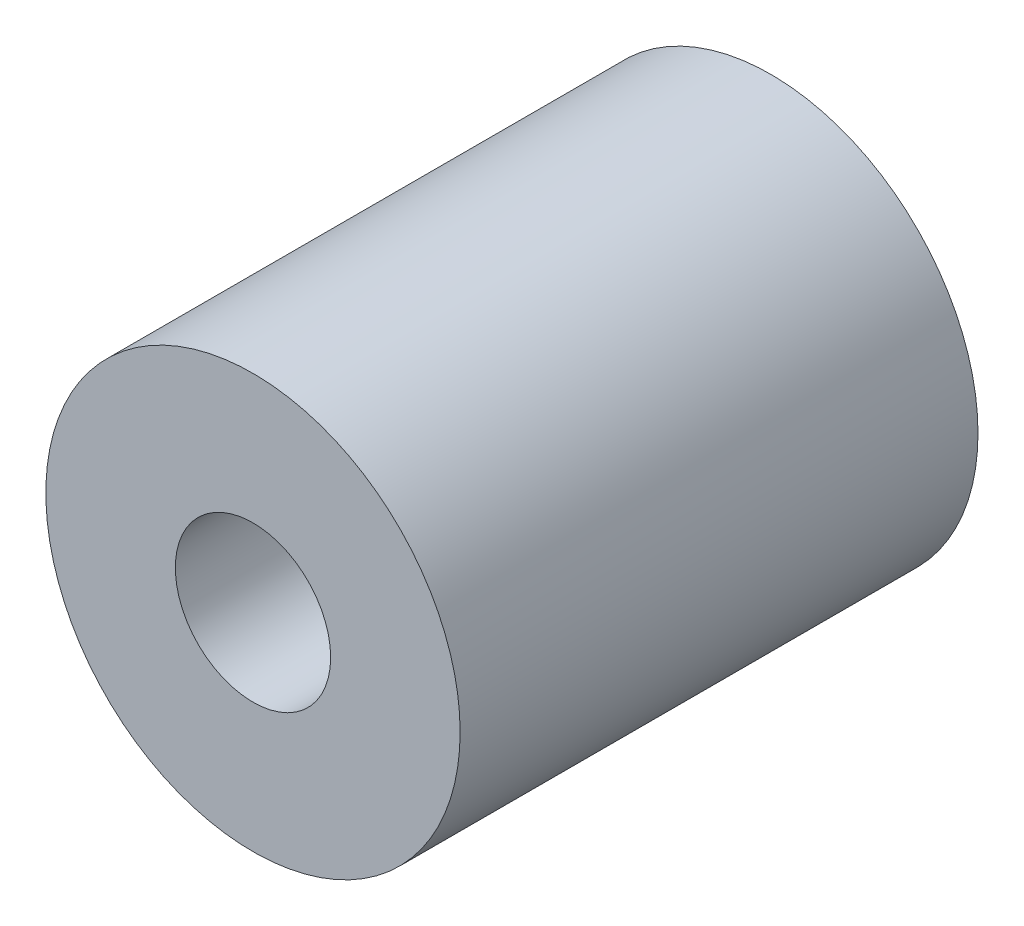
ISO-10303-21;
HEADER;
FILE_DESCRIPTION(('STEP AP214'),'2;1');
FILE_NAME('part.step','',(''),(''),'','','');
FILE_SCHEMA(('AUTOMOTIVE_DESIGN { 1 0 10303 214 1 1 1 1 }'));
ENDSEC;
DATA;
#1=APPLICATION_CONTEXT('core data for automotive mechanical design processes');
#2=APPLICATION_PROTOCOL_DEFINITION('international standard','automotive_design',2000,#1);
#3=PRODUCT_CONTEXT('',#1,'mechanical');
#4=PRODUCT('Part','Part','',(#3));
#5=PRODUCT_RELATED_PRODUCT_CATEGORY('part','',(#4));
#6=PRODUCT_DEFINITION_FORMATION('','',#4);
#7=PRODUCT_DEFINITION_CONTEXT('part definition',#1,'design');
#8=PRODUCT_DEFINITION('design','',#6,#7);
#9=PRODUCT_DEFINITION_SHAPE('','',#8);
#10=(LENGTH_UNIT() NAMED_UNIT(*) SI_UNIT(.MILLI.,.METRE.));
#11=(NAMED_UNIT(*) PLANE_ANGLE_UNIT() SI_UNIT($,.RADIAN.));
#12=(NAMED_UNIT(*) SI_UNIT($,.STERADIAN.) SOLID_ANGLE_UNIT());
#13=UNCERTAINTY_MEASURE_WITH_UNIT(LENGTH_MEASURE(1.E-05),#10,'distance_accuracy_value','');
#14=(GEOMETRIC_REPRESENTATION_CONTEXT(3) GLOBAL_UNCERTAINTY_ASSIGNED_CONTEXT((#13)) GLOBAL_UNIT_ASSIGNED_CONTEXT((#10,
#11,#12)) REPRESENTATION_CONTEXT('',''));
#15=CARTESIAN_POINT('',(0.,0.,0.));
#16=DIRECTION('',(0.,0.,1.));
#17=DIRECTION('',(1.,0.,0.));
#18=AXIS2_PLACEMENT_3D('',#15,#16,#17);
#19=CARTESIAN_POINT('',(0.,0.,-10.));
#20=DIRECTION('',(0.,0.,1.));
#21=DIRECTION('',(1.,0.,0.));
#22=AXIS2_PLACEMENT_3D('',#19,#20,#21);
#23=CYLINDRICAL_SURFACE('',#22,8.);
#24=CARTESIAN_POINT('',(0.,0.,-10.));
#25=DIRECTION('',(0.,0.,1.));
#26=DIRECTION('',(1.,0.,0.));
#27=AXIS2_PLACEMENT_3D('',#24,#25,#26);
#28=CIRCLE('',#27,8.);
#29=CARTESIAN_POINT('',(8.,0.,-10.));
#30=VERTEX_POINT('',#29);
#31=EDGE_CURVE('E10',#30,#30,#28,.T.);
#32=ORIENTED_EDGE('',*,*,#31,.T.);
#33=EDGE_LOOP('',(#32));
#34=FACE_BOUND('',#33,.T.);
#35=CARTESIAN_POINT('',(0.,0.,10.));
#36=DIRECTION('',(0.,0.,1.));
#37=DIRECTION('',(1.,0.,0.));
#38=AXIS2_PLACEMENT_3D('',#35,#36,#37);
#39=CIRCLE('',#38,8.);
#40=CARTESIAN_POINT('',(8.,0.,10.));
#41=VERTEX_POINT('',#40);
#42=EDGE_CURVE('E39',#41,#41,#39,.T.);
#43=ORIENTED_EDGE('',*,*,#42,.F.);
#44=EDGE_LOOP('',(#43));
#45=FACE_BOUND('',#44,.T.);
#46=ADVANCED_FACE('F32',(#34,#45),#23,.T.);
#47=CARTESIAN_POINT('',(0.,0.,-10.));
#48=DIRECTION('',(0.,0.,1.));
#49=DIRECTION('',(1.,0.,0.));
#50=AXIS2_PLACEMENT_3D('',#47,#48,#49);
#51=PLANE('',#50);
#52=CARTESIAN_POINT('',(0.,0.,-10.));
#53=DIRECTION('',(0.,0.,-1.));
#54=DIRECTION('',(-1.,0.,0.));
#55=AXIS2_PLACEMENT_3D('',#52,#53,#54);
#56=CIRCLE('',#55,2.5);
#57=CARTESIAN_POINT('',(-2.5,0.,-10.));
#58=VERTEX_POINT('',#57);
#59=EDGE_CURVE('E51',#58,#58,#56,.T.);
#60=ORIENTED_EDGE('',*,*,#59,.F.);
#61=EDGE_LOOP('',(#60));
#62=FACE_BOUND('',#61,.T.);
#63=ORIENTED_EDGE('',*,*,#31,.F.);
#64=EDGE_LOOP('',(#63));
#65=FACE_BOUND('',#64,.T.);
#66=ADVANCED_FACE('F71',(#62,#65),#51,.F.);
#67=CARTESIAN_POINT('',(0.,0.,10.));
#68=DIRECTION('',(0.,0.,1.));
#69=DIRECTION('',(1.,0.,0.));
#70=AXIS2_PLACEMENT_3D('',#67,#68,#69);
#71=PLANE('',#70);
#72=CARTESIAN_POINT('',(0.,0.,10.));
#73=DIRECTION('',(0.,0.,1.));
#74=DIRECTION('',(1.,0.,0.));
#75=AXIS2_PLACEMENT_3D('',#72,#73,#74);
#76=CIRCLE('',#75,2.99999999999999);
#77=CARTESIAN_POINT('',(2.99999999999999,0.,10.));
#78=VERTEX_POINT('',#77);
#79=EDGE_CURVE('E48',#78,#78,#76,.T.);
#80=ORIENTED_EDGE('',*,*,#79,.F.);
#81=EDGE_LOOP('',(#80));
#82=FACE_BOUND('',#81,.T.);
#83=ORIENTED_EDGE('',*,*,#42,.T.);
#84=EDGE_LOOP('',(#83));
#85=FACE_BOUND('',#84,.T.);
#86=ADVANCED_FACE('F75',(#82,#85),#71,.T.);
#87=CARTESIAN_POINT('',(0.,0.,1.80258185708268));
#88=DIRECTION('',(0.,0.,1.));
#89=DIRECTION('',(1.,0.,0.));
#90=AXIS2_PLACEMENT_3D('',#87,#88,#89);
#91=CONICAL_SURFACE('',#90,3.,1.02974425867665);
#92=CARTESIAN_POINT('',(0.,0.,1.5021515475689));
#93=DIRECTION('',(0.,0.,1.));
#94=DIRECTION('',(1.,0.,0.));
#95=AXIS2_PLACEMENT_3D('',#92,#93,#94);
#96=CIRCLE('',#95,2.5);
#97=CARTESIAN_POINT('',(2.5,0.,1.5021515475689));
#98=VERTEX_POINT('',#97);
#99=EDGE_CURVE('E35',#98,#98,#96,.F.);
#100=ORIENTED_EDGE('',*,*,#99,.T.);
#101=EDGE_LOOP('',(#100));
#102=FACE_BOUND('',#101,.T.);
#103=CARTESIAN_POINT('',(0.,0.,1.80258185708268));
#104=DIRECTION('',(0.,0.,1.));
#105=DIRECTION('',(1.,0.,0.));
#106=AXIS2_PLACEMENT_3D('',#103,#104,#105);
#107=CIRCLE('',#106,3.);
#108=CARTESIAN_POINT('',(3.,0.,1.80258185708268));
#109=VERTEX_POINT('',#108);
#110=EDGE_CURVE('E43',#109,#109,#107,.T.);
#111=ORIENTED_EDGE('',*,*,#110,.T.);
#112=EDGE_LOOP('',(#111));
#113=FACE_BOUND('',#112,.T.);
#114=ADVANCED_FACE('F58',(#102,#113),#91,.F.);
#115=CARTESIAN_POINT('',(0.,0.,10.));
#116=DIRECTION('',(0.,0.,1.));
#117=DIRECTION('',(1.,0.,0.));
#118=AXIS2_PLACEMENT_3D('',#115,#116,#117);
#119=CYLINDRICAL_SURFACE('',#118,2.99999999999999);
#120=ORIENTED_EDGE('',*,*,#110,.F.);
#121=EDGE_LOOP('',(#120));
#122=FACE_BOUND('',#121,.T.);
#123=ORIENTED_EDGE('',*,*,#79,.T.);
#124=EDGE_LOOP('',(#123));
#125=FACE_BOUND('',#124,.T.);
#126=ADVANCED_FACE('F63',(#122,#125),#119,.F.);
#127=CARTESIAN_POINT('',(0.,0.,-10.));
#128=DIRECTION('',(0.,0.,-1.));
#129=DIRECTION('',(-1.,0.,0.));
#130=AXIS2_PLACEMENT_3D('',#127,#128,#129);
#131=CYLINDRICAL_SURFACE('',#130,2.5);
#132=ORIENTED_EDGE('',*,*,#59,.T.);
#133=EDGE_LOOP('',(#132));
#134=FACE_BOUND('',#133,.T.);
#135=ORIENTED_EDGE('',*,*,#99,.F.);
#136=EDGE_LOOP('',(#135));
#137=FACE_BOUND('',#136,.T.);
#138=ADVANCED_FACE('F61',(#134,#137),#131,.F.);
#139=CLOSED_SHELL('',(#46,#66,#86,#114,#126,#138));
#140=MANIFOLD_SOLID_BREP('B2',#139);
#141=ADVANCED_BREP_SHAPE_REPRESENTATION('',(#18,#140),#14);
#142=SHAPE_DEFINITION_REPRESENTATION(#9,#141);
ENDSEC;
END-ISO-10303-21;
